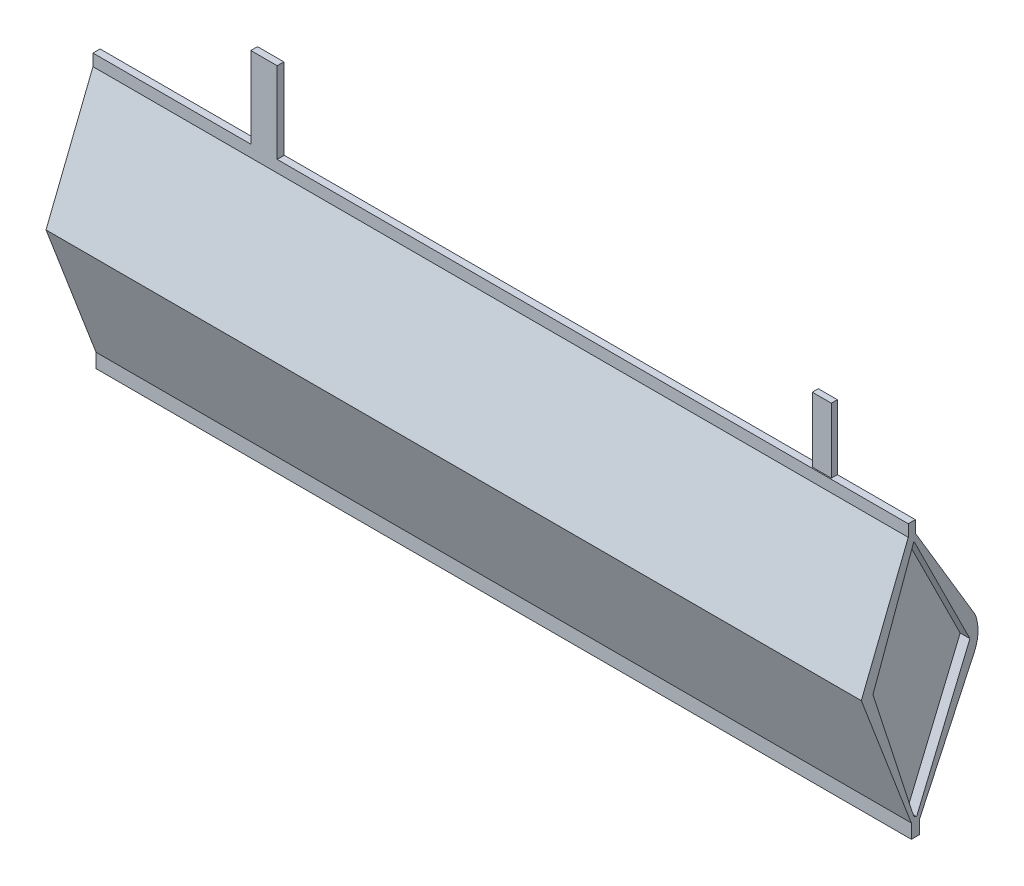
ISO-10303-21;
HEADER;
FILE_DESCRIPTION(('STEP AP214'),'2;1');
FILE_NAME('part.step','',(''),(''),'','','');
FILE_SCHEMA(('AUTOMOTIVE_DESIGN { 1 0 10303 214 1 1 1 1 }'));
ENDSEC;
DATA;
#1=APPLICATION_CONTEXT('core data for automotive mechanical design processes');
#2=APPLICATION_PROTOCOL_DEFINITION('international standard','automotive_design',2000,#1);
#3=PRODUCT_CONTEXT('',#1,'mechanical');
#4=PRODUCT('Part','Part','',(#3));
#5=PRODUCT_RELATED_PRODUCT_CATEGORY('part','',(#4));
#6=PRODUCT_DEFINITION_FORMATION('','',#4);
#7=PRODUCT_DEFINITION_CONTEXT('part definition',#1,'design');
#8=PRODUCT_DEFINITION('design','',#6,#7);
#9=PRODUCT_DEFINITION_SHAPE('','',#8);
#10=(LENGTH_UNIT() NAMED_UNIT(*) SI_UNIT(.MILLI.,.METRE.));
#11=(NAMED_UNIT(*) PLANE_ANGLE_UNIT() SI_UNIT($,.RADIAN.));
#12=(NAMED_UNIT(*) SI_UNIT($,.STERADIAN.) SOLID_ANGLE_UNIT());
#13=UNCERTAINTY_MEASURE_WITH_UNIT(LENGTH_MEASURE(1.E-05),#10,'distance_accuracy_value','');
#14=(GEOMETRIC_REPRESENTATION_CONTEXT(3) GLOBAL_UNCERTAINTY_ASSIGNED_CONTEXT((#13)) GLOBAL_UNIT_ASSIGNED_CONTEXT((#10,
#11,#12)) REPRESENTATION_CONTEXT('',''));
#15=CARTESIAN_POINT('',(0.,0.,0.));
#16=DIRECTION('',(0.,0.,1.));
#17=DIRECTION('',(1.,0.,0.));
#18=AXIS2_PLACEMENT_3D('',#15,#16,#17);
#19=CARTESIAN_POINT('',(-10.1405450074318,17.5056411192811,37.0439177567727));
#20=DIRECTION('',(0.,-1.,0.));
#21=DIRECTION('',(0.,0.,-1.));
#22=AXIS2_PLACEMENT_3D('',#19,#20,#21);
#23=PLANE('',#22);
#24=DIRECTION('',(0.,0.,-1.));
#25=VECTOR('',#24,1.);
#26=CARTESIAN_POINT('',(-62.8147187451587,17.5056411192811,28.9556068649932));
#27=LINE('',#26,#25);
#28=CARTESIAN_POINT('',(-62.8147187451587,17.5056411192811,29.7823314594479));
#29=VERTEX_POINT('',#28);
#30=CARTESIAN_POINT('',(-62.8147187451587,17.5056411192811,28.9556068649932));
#31=VERTEX_POINT('',#30);
#32=EDGE_CURVE('E261',#29,#31,#27,.T.);
#33=ORIENTED_EDGE('',*,*,#32,.F.);
#34=DIRECTION('',(1.,0.,0.));
#35=VECTOR('',#34,1.);
#36=CARTESIAN_POINT('',(-17.0060525794227,17.5056411192811,29.7823314594479));
#37=LINE('',#36,#35);
#38=CARTESIAN_POINT('',(14.9939474205773,17.5056411192811,29.7823314594479));
#39=VERTEX_POINT('',#38);
#40=EDGE_CURVE('E471',#29,#39,#37,.T.);
#41=ORIENTED_EDGE('',*,*,#40,.T.);
#42=DIRECTION('',(0.,0.,-1.));
#43=VECTOR('',#42,1.);
#44=CARTESIAN_POINT('',(14.9939474205773,17.5056411192811,37.0439177567727));
#45=LINE('',#44,#43);
#46=CARTESIAN_POINT('',(14.9939474205773,17.5056411192811,28.9060713444781));
#47=VERTEX_POINT('',#46);
#48=EDGE_CURVE('E475',#39,#47,#45,.T.);
#49=ORIENTED_EDGE('',*,*,#48,.T.);
#50=DIRECTION('',(1.,0.,0.));
#51=VECTOR('',#50,1.);
#52=CARTESIAN_POINT('',(-17.0060525794227,17.5056411192811,28.9060713444781));
#53=LINE('',#52,#51);
#54=CARTESIAN_POINT('',(5.37584407242301,17.5056411192811,28.9060713444781));
#55=VERTEX_POINT('',#54);
#56=EDGE_CURVE('E441',#55,#47,#53,.T.);
#57=ORIENTED_EDGE('',*,*,#56,.F.);
#58=DIRECTION('',(0.,0.,-1.));
#59=VECTOR('',#58,1.);
#60=CARTESIAN_POINT('',(5.37584407242301,17.5056411192811,29.6523771630587));
#61=LINE('',#60,#59);
#62=CARTESIAN_POINT('',(5.37584407242301,17.5056411192811,29.6523771630587));
#63=VERTEX_POINT('',#62);
#64=EDGE_CURVE('E360',#63,#55,#61,.T.);
#65=ORIENTED_EDGE('',*,*,#64,.F.);
#66=DIRECTION('',(1.,0.,0.));
#67=VECTOR('',#66,1.);
#68=CARTESIAN_POINT('',(5.37584407242301,17.5056411192811,29.6523771630587));
#69=LINE('',#68,#67);
#70=CARTESIAN_POINT('',(3.02748880821109,17.5056411192811,29.6523771630587));
#71=VERTEX_POINT('',#70);
#72=EDGE_CURVE('E369',#71,#63,#69,.T.);
#73=ORIENTED_EDGE('',*,*,#72,.F.);
#74=DIRECTION('',(0.,0.,1.));
#75=VECTOR('',#74,1.);
#76=CARTESIAN_POINT('',(3.02748880821109,17.5056411192811,29.6523771630587));
#77=LINE('',#76,#75);
#78=CARTESIAN_POINT('',(3.02748880821109,17.5056411192811,28.9060713444781));
#79=VERTEX_POINT('',#78);
#80=EDGE_CURVE('E355',#79,#71,#77,.T.);
#81=ORIENTED_EDGE('',*,*,#80,.F.);
#82=CARTESIAN_POINT('',(-85.5212621145849,17.5056411192811,28.9060713444781));
#83=VERTEX_POINT('',#82);
#84=EDGE_CURVE('E447',#83,#79,#53,.T.);
#85=ORIENTED_EDGE('',*,*,#84,.F.);
#86=DIRECTION('',(0.,0.,-1.));
#87=VECTOR('',#86,1.);
#88=CARTESIAN_POINT('',(-85.5212621145849,17.5056411192811,28.9060713444781));
#89=LINE('',#88,#87);
#90=CARTESIAN_POINT('',(-85.5212621145849,17.5056411192811,29.7823314594479));
#91=VERTEX_POINT('',#90);
#92=EDGE_CURVE('E303',#91,#83,#89,.T.);
#93=ORIENTED_EDGE('',*,*,#92,.F.);
#94=CARTESIAN_POINT('',(-66.0647373288725,17.5056411192811,29.7823314594479));
#95=VERTEX_POINT('',#94);
#96=EDGE_CURVE('E469',#91,#95,#37,.T.);
#97=ORIENTED_EDGE('',*,*,#96,.T.);
#98=DIRECTION('',(0.,0.,1.));
#99=VECTOR('',#98,1.);
#100=CARTESIAN_POINT('',(-66.0647373288725,17.5056411192811,28.9556068649932));
#101=LINE('',#100,#99);
#102=CARTESIAN_POINT('',(-66.0647373288725,17.5056411192811,28.9556068649932));
#103=VERTEX_POINT('',#102);
#104=EDGE_CURVE('E55',#103,#95,#101,.T.);
#105=ORIENTED_EDGE('',*,*,#104,.F.);
#106=DIRECTION('',(-1.,0.,0.));
#107=VECTOR('',#106,1.);
#108=CARTESIAN_POINT('',(-66.0647373288725,17.5056411192811,28.9556068649932));
#109=LINE('',#108,#107);
#110=EDGE_CURVE('E50',#31,#103,#109,.T.);
#111=ORIENTED_EDGE('',*,*,#110,.F.);
#112=EDGE_LOOP('',(#33,#41,#49,#57,#65,#73,#81,#85,#93,#97,#105,#111));
#113=FACE_BOUND('',#112,.T.);
#114=ADVANCED_FACE('F35',(#113),#23,.F.);
#115=CARTESIAN_POINT('',(14.9939474205773,17.5056411192811,37.0439177567727));
#116=DIRECTION('',(-1.,0.,0.));
#117=DIRECTION('',(0.,0.,1.));
#118=AXIS2_PLACEMENT_3D('',#115,#116,#117);
#119=PLANE('',#118);
#120=DIRECTION('',(0.,-0.939498101775437,0.34255410778496));
#121=VECTOR('',#120,1.);
#122=CARTESIAN_POINT('',(14.9939474205773,15.2881641035008,29.0885573251257));
#123=LINE('',#122,#121);
#124=CARTESIAN_POINT('',(14.9939474205773,15.2881641035008,29.0885573251257));
#125=VERTEX_POINT('',#124);
#126=CARTESIAN_POINT('',(14.9939474205773,1.43957116866306,34.1379474068146));
#127=VERTEX_POINT('',#126);
#128=EDGE_CURVE('E404',#125,#127,#123,.T.);
#129=ORIENTED_EDGE('',*,*,#128,.F.);
#130=DIRECTION('',(0.,0.894888871151744,0.446289041192766));
#131=VECTOR('',#130,1.);
#132=CARTESIAN_POINT('',(14.9939474205773,1.43957116866306,22.1821408280659));
#133=LINE('',#132,#131);
#134=CARTESIAN_POINT('',(14.9939474205773,1.43957116866306,22.1821408280659));
#135=VERTEX_POINT('',#134);
#136=EDGE_CURVE('E385',#135,#125,#133,.T.);
#137=ORIENTED_EDGE('',*,*,#136,.F.);
#138=DIRECTION('',(0.,0.922414525454659,-0.386201298845896));
#139=VECTOR('',#138,1.);
#140=CARTESIAN_POINT('',(14.9939474205773,-14.2700907355062,28.7595435731382));
#141=LINE('',#140,#139);
#142=CARTESIAN_POINT('',(14.9939474205773,-14.2700907355062,28.7595435731382));
#143=VERTEX_POINT('',#142);
#144=EDGE_CURVE('E390',#143,#135,#141,.T.);
#145=ORIENTED_EDGE('',*,*,#144,.F.);
#146=DIRECTION('',(0.,-0.423128591443833,-0.906069641419884));
#147=VECTOR('',#146,1.);
#148=CARTESIAN_POINT('',(14.9939474205773,-14.1164434670402,29.0885573251257));
#149=LINE('',#148,#147);
#150=CARTESIAN_POINT('',(14.9939474205773,-14.1164434670402,29.0885573251257));
#151=VERTEX_POINT('',#150);
#152=EDGE_CURVE('E410',#151,#143,#149,.T.);
#153=ORIENTED_EDGE('',*,*,#152,.F.);
#154=DIRECTION('',(0.,-0.951147499434773,-0.308736836673207));
#155=VECTOR('',#154,1.);
#156=CARTESIAN_POINT('',(14.9939474205773,1.43957116866306,34.1379474068146));
#157=LINE('',#156,#155);
#158=EDGE_CURVE('E407',#127,#151,#157,.T.);
#159=ORIENTED_EDGE('',*,*,#158,.F.);
#160=EDGE_LOOP('',(#129,#137,#145,#153,#159));
#161=FACE_BOUND('',#160,.T.);
#162=DIRECTION('',(0.,-0.906069641419884,0.423128591443834));
#163=VECTOR('',#162,1.);
#164=CARTESIAN_POINT('',(14.9939474205773,2.06125335554349,20.5544841655735));
#165=LINE('',#164,#163);
#166=CARTESIAN_POINT('',(14.9939474205773,-0.145561830209633,21.5850524115874));
#167=VERTEX_POINT('',#166);
#168=CARTESIAN_POINT('',(14.9939474205773,-14.6859081953666,28.3752989835319));
#169=VERTEX_POINT('',#168);
#170=EDGE_CURVE('E435',#167,#169,#165,.T.);
#171=ORIENTED_EDGE('',*,*,#170,.F.);
#172=CARTESIAN_POINT('',(14.9939474205773,1.83319011203405,26.222220961359));
#173=DIRECTION('',(-1.,0.,0.));
#174=DIRECTION('',(0.,0.,1.));
#175=AXIS2_PLACEMENT_3D('',#172,#173,#174);
#176=CIRCLE('',#175,5.04170520835203);
#177=CARTESIAN_POINT('',(14.9939474205773,3.73098867829227,21.5513375320887));
#178=VERTEX_POINT('',#177);
#179=EDGE_CURVE('E417',#167,#178,#176,.F.);
#180=ORIENTED_EDGE('',*,*,#179,.T.);
#181=DIRECTION('',(0.,-0.85862241369767,-0.512608574543957));
#182=VECTOR('',#181,1.);
#183=CARTESIAN_POINT('',(14.9939474205773,16.0502115935854,28.9060713444781));
#184=LINE('',#183,#182);
#185=CARTESIAN_POINT('',(14.9939474205773,16.0502115935854,28.9060713444781));
#186=VERTEX_POINT('',#185);
#187=EDGE_CURVE('E433',#186,#178,#184,.T.);
#188=ORIENTED_EDGE('',*,*,#187,.F.);
#189=DIRECTION('',(0.,-1.,0.));
#190=VECTOR('',#189,1.);
#191=CARTESIAN_POINT('',(14.9939474205773,17.5056411192811,28.9060713444781));
#192=LINE('',#191,#190);
#193=EDGE_CURVE('E430',#47,#186,#192,.T.);
#194=ORIENTED_EDGE('',*,*,#193,.F.);
#195=ORIENTED_EDGE('',*,*,#48,.F.);
#196=DIRECTION('',(0.,-1.,0.));
#197=VECTOR('',#196,1.);
#198=CARTESIAN_POINT('',(14.9939474205773,0.561189804540041,29.7823314594479));
#199=LINE('',#198,#197);
#200=CARTESIAN_POINT('',(14.9939474205773,16.0524594077059,29.7823314594479));
#201=VERTEX_POINT('',#200);
#202=EDGE_CURVE('E452',#39,#201,#199,.T.);
#203=ORIENTED_EDGE('',*,*,#202,.T.);
#204=DIRECTION('',(0.,-0.928999989043887,0.370079748644069));
#205=VECTOR('',#204,1.);
#206=CARTESIAN_POINT('',(14.9939474205773,7.06237754820205,33.3636525295148));
#207=LINE('',#206,#205);
#208=CARTESIAN_POINT('',(14.9939474205773,1.51675664046694,35.5728258511659));
#209=VERTEX_POINT('',#208);
#210=EDGE_CURVE('E444',#201,#209,#207,.T.);
#211=ORIENTED_EDGE('',*,*,#210,.T.);
#212=DIRECTION('',(0.,-0.934146484006521,-0.356889823920849));
#213=VECTOR('',#212,1.);
#214=CARTESIAN_POINT('',(14.9939474205773,-5.49440333280212,32.8942184901351));
#215=LINE('',#214,#213);
#216=CARTESIAN_POINT('',(14.9939474205773,-14.6317808860375,29.4032916152771));
#217=VERTEX_POINT('',#216);
#218=EDGE_CURVE('E458',#209,#217,#215,.T.);
#219=ORIENTED_EDGE('',*,*,#218,.T.);
#220=DIRECTION('',(0.,-1.,0.));
#221=VECTOR('',#220,1.);
#222=CARTESIAN_POINT('',(14.9939474205773,0.561189804540041,29.4032916152771));
#223=LINE('',#222,#221);
#224=CARTESIAN_POINT('',(14.9939474205773,-16.383261510201,29.4032916152771));
#225=VERTEX_POINT('',#224);
#226=EDGE_CURVE('E455',#217,#225,#223,.T.);
#227=ORIENTED_EDGE('',*,*,#226,.T.);
#228=DIRECTION('',(0.,0.,-1.));
#229=VECTOR('',#228,1.);
#230=CARTESIAN_POINT('',(14.9939474205773,-16.383261510201,37.0439177567727));
#231=LINE('',#230,#229);
#232=CARTESIAN_POINT('',(14.9939474205773,-16.383261510201,28.3752989835319));
#233=VERTEX_POINT('',#232);
#234=EDGE_CURVE('E464',#225,#233,#231,.T.);
#235=ORIENTED_EDGE('',*,*,#234,.T.);
#236=DIRECTION('',(0.,-1.,0.));
#237=VECTOR('',#236,1.);
#238=CARTESIAN_POINT('',(14.9939474205773,-14.6859081953666,28.3752989835319));
#239=LINE('',#238,#237);
#240=EDGE_CURVE('E438',#169,#233,#239,.T.);
#241=ORIENTED_EDGE('',*,*,#240,.F.);
#242=EDGE_LOOP('',(#171,#180,#188,#194,#195,#203,#211,#219,#227,#235,#241));
#243=FACE_BOUND('',#242,.T.);
#244=ADVANCED_FACE('F37',(#161,#243),#119,.F.);
#245=CARTESIAN_POINT('',(-10.1405450074318,-16.383261510201,37.0439177567727));
#246=DIRECTION('',(0.,1.,0.));
#247=DIRECTION('',(0.,0.,1.));
#248=AXIS2_PLACEMENT_3D('',#245,#246,#247);
#249=PLANE('',#248);
#250=DIRECTION('',(0.,0.,1.));
#251=VECTOR('',#250,1.);
#252=CARTESIAN_POINT('',(-5.52126211458491,-16.383261510201,29.4032916152771));
#253=LINE('',#252,#251);
#254=CARTESIAN_POINT('',(-5.52126211458491,-16.383261510201,28.0872107985033));
#255=VERTEX_POINT('',#254);
#256=CARTESIAN_POINT('',(-5.52126211458491,-16.383261510201,28.3752989835319));
#257=VERTEX_POINT('',#256);
#258=EDGE_CURVE('E274',#255,#257,#253,.T.);
#259=ORIENTED_EDGE('',*,*,#258,.T.);
#260=DIRECTION('',(1.,0.,0.));
#261=VECTOR('',#260,1.);
#262=CARTESIAN_POINT('',(-10.1405450074318,-16.383261510201,28.3752989835319));
#263=LINE('',#262,#261);
#264=EDGE_CURVE('E43',#257,#233,#263,.T.);
#265=ORIENTED_EDGE('',*,*,#264,.T.);
#266=ORIENTED_EDGE('',*,*,#234,.F.);
#267=DIRECTION('',(1.,0.,0.));
#268=VECTOR('',#267,1.);
#269=CARTESIAN_POINT('',(-17.0060525794227,-16.383261510201,29.4032916152771));
#270=LINE('',#269,#268);
#271=CARTESIAN_POINT('',(-85.5212621145849,-16.383261510201,29.4032916152771));
#272=VERTEX_POINT('',#271);
#273=EDGE_CURVE('E467',#272,#225,#270,.T.);
#274=ORIENTED_EDGE('',*,*,#273,.F.);
#275=DIRECTION('',(0.,0.,1.));
#276=VECTOR('',#275,1.);
#277=CARTESIAN_POINT('',(-85.5212621145849,-16.383261510201,29.4032916152771));
#278=LINE('',#277,#276);
#279=CARTESIAN_POINT('',(-85.5212621145849,-16.383261510201,28.0872107985033));
#280=VERTEX_POINT('',#279);
#281=EDGE_CURVE('E288',#280,#272,#278,.T.);
#282=ORIENTED_EDGE('',*,*,#281,.F.);
#283=DIRECTION('',(1.,0.,0.));
#284=VECTOR('',#283,1.);
#285=CARTESIAN_POINT('',(-85.5212621145849,-16.383261510201,28.0872107985033));
#286=LINE('',#285,#284);
#287=EDGE_CURVE('E305',#280,#255,#286,.T.);
#288=ORIENTED_EDGE('',*,*,#287,.T.);
#289=EDGE_LOOP('',(#259,#265,#266,#274,#282,#288));
#290=FACE_BOUND('',#289,.T.);
#291=ADVANCED_FACE('F480',(#290),#249,.F.);
#292=CARTESIAN_POINT('',(-17.0060525794227,7.06237754820205,33.3636525295148));
#293=DIRECTION('',(0.,0.370079748644069,0.928999989043887));
#294=DIRECTION('',(0.,-0.928999989043887,0.370079748644069));
#295=AXIS2_PLACEMENT_3D('',#292,#293,#294);
#296=PLANE('',#295);
#297=DIRECTION('',(1.,0.,0.));
#298=VECTOR('',#297,1.);
#299=CARTESIAN_POINT('',(-17.0060525794227,16.0524594077059,29.7823314594479));
#300=LINE('',#299,#298);
#301=CARTESIAN_POINT('',(-85.5212621145849,16.0524594077059,29.7823314594479));
#302=VERTEX_POINT('',#301);
#303=EDGE_CURVE('E461',#302,#201,#300,.T.);
#304=ORIENTED_EDGE('',*,*,#303,.F.);
#305=DIRECTION('',(0.,0.928999989043887,-0.370079748644069));
#306=VECTOR('',#305,1.);
#307=CARTESIAN_POINT('',(-85.5212621145849,16.0524594077059,29.7823314594479));
#308=LINE('',#307,#306);
#309=CARTESIAN_POINT('',(-85.5212621145849,1.51675664046694,35.5728258511659));
#310=VERTEX_POINT('',#309);
#311=EDGE_CURVE('E297',#310,#302,#308,.T.);
#312=ORIENTED_EDGE('',*,*,#311,.F.);
#313=DIRECTION('',(1.,0.,0.));
#314=VECTOR('',#313,1.);
#315=CARTESIAN_POINT('',(-17.0060525794227,1.51675664046694,35.5728258511659));
#316=LINE('',#315,#314);
#317=EDGE_CURVE('E462',#310,#209,#316,.T.);
#318=ORIENTED_EDGE('',*,*,#317,.T.);
#319=ORIENTED_EDGE('',*,*,#210,.F.);
#320=EDGE_LOOP('',(#304,#312,#318,#319));
#321=FACE_BOUND('',#320,.T.);
#322=ADVANCED_FACE('F529',(#321),#296,.T.);
#323=CARTESIAN_POINT('',(-17.0060525794227,-5.49440333280212,32.8942184901351));
#324=DIRECTION('',(0.,-0.356889823920849,0.934146484006521));
#325=DIRECTION('',(0.,-0.934146484006521,-0.356889823920849));
#326=AXIS2_PLACEMENT_3D('',#323,#324,#325);
#327=PLANE('',#326);
#328=ORIENTED_EDGE('',*,*,#317,.F.);
#329=DIRECTION('',(0.,0.934146484006521,0.356889823920849));
#330=VECTOR('',#329,1.);
#331=CARTESIAN_POINT('',(-85.5212621145849,1.51675664046694,35.5728258511659));
#332=LINE('',#331,#330);
#333=CARTESIAN_POINT('',(-85.5212621145849,-14.6317808860375,29.4032916152771));
#334=VERTEX_POINT('',#333);
#335=EDGE_CURVE('E294',#334,#310,#332,.T.);
#336=ORIENTED_EDGE('',*,*,#335,.F.);
#337=DIRECTION('',(1.,0.,0.));
#338=VECTOR('',#337,1.);
#339=CARTESIAN_POINT('',(-17.0060525794227,-14.6317808860375,29.4032916152771));
#340=LINE('',#339,#338);
#341=EDGE_CURVE('E465',#334,#217,#340,.T.);
#342=ORIENTED_EDGE('',*,*,#341,.T.);
#343=ORIENTED_EDGE('',*,*,#218,.F.);
#344=EDGE_LOOP('',(#328,#336,#342,#343));
#345=FACE_BOUND('',#344,.T.);
#346=ADVANCED_FACE('F532',(#345),#327,.T.);
#347=CARTESIAN_POINT('',(-17.0060525794227,0.561189804540041,29.7823314594479));
#348=DIRECTION('',(0.,0.,1.));
#349=DIRECTION('',(1.,0.,0.));
#350=AXIS2_PLACEMENT_3D('',#347,#348,#349);
#351=PLANE('',#350);
#352=ORIENTED_EDGE('',*,*,#96,.F.);
#353=DIRECTION('',(0.,1.,0.));
#354=VECTOR('',#353,1.);
#355=CARTESIAN_POINT('',(-85.5212621145849,17.5056411192811,29.7823314594479));
#356=LINE('',#355,#354);
#357=EDGE_CURVE('E300',#302,#91,#356,.T.);
#358=ORIENTED_EDGE('',*,*,#357,.F.);
#359=ORIENTED_EDGE('',*,*,#303,.T.);
#360=ORIENTED_EDGE('',*,*,#202,.F.);
#361=ORIENTED_EDGE('',*,*,#40,.F.);
#362=DIRECTION('',(0.,-1.,0.));
#363=VECTOR('',#362,1.);
#364=CARTESIAN_POINT('',(-62.8147187451587,27.5056411192811,29.7823314594479));
#365=LINE('',#364,#363);
#366=CARTESIAN_POINT('',(-62.8147187451587,27.5056411192811,29.7823314594479));
#367=VERTEX_POINT('',#366);
#368=EDGE_CURVE('E542',#367,#29,#365,.T.);
#369=ORIENTED_EDGE('',*,*,#368,.F.);
#370=DIRECTION('',(1.,0.,0.));
#371=VECTOR('',#370,1.);
#372=CARTESIAN_POINT('',(-66.0647373288725,27.5056411192811,29.7823314594479));
#373=LINE('',#372,#371);
#374=CARTESIAN_POINT('',(-66.0647373288725,27.5056411192811,29.7823314594479));
#375=VERTEX_POINT('',#374);
#376=EDGE_CURVE('E255',#375,#367,#373,.T.);
#377=ORIENTED_EDGE('',*,*,#376,.F.);
#378=DIRECTION('',(0.,-1.,0.));
#379=VECTOR('',#378,1.);
#380=CARTESIAN_POINT('',(-66.0647373288725,27.5056411192811,29.7823314594479));
#381=LINE('',#380,#379);
#382=EDGE_CURVE('E266',#375,#95,#381,.T.);
#383=ORIENTED_EDGE('',*,*,#382,.T.);
#384=EDGE_LOOP('',(#352,#358,#359,#360,#361,#369,#377,#383));
#385=FACE_BOUND('',#384,.T.);
#386=ADVANCED_FACE('F525',(#385),#351,.T.);
#387=CARTESIAN_POINT('',(-17.0060525794227,0.561189804540041,29.4032916152771));
#388=DIRECTION('',(0.,0.,1.));
#389=DIRECTION('',(1.,0.,0.));
#390=AXIS2_PLACEMENT_3D('',#387,#388,#389);
#391=PLANE('',#390);
#392=ORIENTED_EDGE('',*,*,#341,.F.);
#393=DIRECTION('',(0.,1.,0.));
#394=VECTOR('',#393,1.);
#395=CARTESIAN_POINT('',(-85.5212621145849,-14.6317808860375,29.4032916152771));
#396=LINE('',#395,#394);
#397=EDGE_CURVE('E291',#272,#334,#396,.T.);
#398=ORIENTED_EDGE('',*,*,#397,.F.);
#399=ORIENTED_EDGE('',*,*,#273,.T.);
#400=ORIENTED_EDGE('',*,*,#226,.F.);
#401=EDGE_LOOP('',(#392,#398,#399,#400));
#402=FACE_BOUND('',#401,.T.);
#403=ADVANCED_FACE('F491',(#402),#391,.T.);
#404=CARTESIAN_POINT('',(-17.0060525794227,2.06125335554349,20.5544841655735));
#405=DIRECTION('',(0.,0.423128591443834,0.906069641419884));
#406=DIRECTION('',(0.,-0.906069641419884,0.423128591443834));
#407=AXIS2_PLACEMENT_3D('',#404,#405,#406);
#408=PLANE('',#407);
#409=DIRECTION('',(1.,0.,0.));
#410=VECTOR('',#409,1.);
#411=CARTESIAN_POINT('',(-17.0060525794227,-14.6859081953666,28.3752989835319));
#412=LINE('',#411,#410);
#413=CARTESIAN_POINT('',(-5.52126211458491,-14.6859081953666,28.3752989835319));
#414=VERTEX_POINT('',#413);
#415=EDGE_CURVE('E442',#414,#169,#412,.T.);
#416=ORIENTED_EDGE('',*,*,#415,.F.);
#417=DIRECTION('',(0.,0.906069641419884,-0.423128591443834));
#418=VECTOR('',#417,1.);
#419=CARTESIAN_POINT('',(-5.52126211458491,2.06125335554349,20.5544841655735));
#420=LINE('',#419,#418);
#421=CARTESIAN_POINT('',(-5.5212621145849,-0.145561830209644,21.5850524115874));
#422=VERTEX_POINT('',#421);
#423=EDGE_CURVE('E349',#414,#422,#420,.T.);
#424=ORIENTED_EDGE('',*,*,#423,.T.);
#425=DIRECTION('',(-1.,0.,0.));
#426=VECTOR('',#425,1.);
#427=CARTESIAN_POINT('',(21.8594549925682,-0.145561830209657,21.5850524115874));
#428=LINE('',#427,#426);
#429=EDGE_CURVE('E428',#422,#167,#428,.F.);
#430=ORIENTED_EDGE('',*,*,#429,.T.);
#431=ORIENTED_EDGE('',*,*,#170,.T.);
#432=EDGE_LOOP('',(#416,#424,#430,#431));
#433=FACE_BOUND('',#432,.T.);
#434=ADVANCED_FACE('F508',(#433),#408,.F.);
#435=CARTESIAN_POINT('',(-17.0060525794227,16.0502115935854,28.9060713444781));
#436=DIRECTION('',(0.,-0.512608574543957,0.85862241369767));
#437=DIRECTION('',(0.,-0.85862241369767,-0.512608574543957));
#438=AXIS2_PLACEMENT_3D('',#435,#436,#437);
#439=PLANE('',#438);
#440=DIRECTION('',(-1.,0.,0.));
#441=VECTOR('',#440,1.);
#442=CARTESIAN_POINT('',(21.8594549925682,3.73098867829227,21.5513375320887));
#443=LINE('',#442,#441);
#444=CARTESIAN_POINT('',(-5.52126211458491,3.73098867829227,21.5513375320887));
#445=VERTEX_POINT('',#444);
#446=EDGE_CURVE('E11',#178,#445,#443,.T.);
#447=ORIENTED_EDGE('',*,*,#446,.T.);
#448=DIRECTION('',(0.,0.85862241369767,0.512608574543957));
#449=VECTOR('',#448,1.);
#450=CARTESIAN_POINT('',(-5.52126211458491,16.0502115935854,28.9060713444781));
#451=LINE('',#450,#449);
#452=CARTESIAN_POINT('',(-5.52126211458491,16.0502115935854,28.9060713444781));
#453=VERTEX_POINT('',#452);
#454=EDGE_CURVE('E343',#445,#453,#451,.T.);
#455=ORIENTED_EDGE('',*,*,#454,.T.);
#456=DIRECTION('',(1.,0.,0.));
#457=VECTOR('',#456,1.);
#458=CARTESIAN_POINT('',(-17.0060525794227,16.0502115935854,28.9060713444781));
#459=LINE('',#458,#457);
#460=EDGE_CURVE('E445',#453,#186,#459,.T.);
#461=ORIENTED_EDGE('',*,*,#460,.T.);
#462=ORIENTED_EDGE('',*,*,#187,.T.);
#463=EDGE_LOOP('',(#447,#455,#461,#462));
#464=FACE_BOUND('',#463,.T.);
#465=ADVANCED_FACE('F517',(#464),#439,.F.);
#466=CARTESIAN_POINT('',(-17.0060525794227,17.5056411192811,28.9060713444781));
#467=DIRECTION('',(0.,0.,1.));
#468=DIRECTION('',(1.,0.,0.));
#469=AXIS2_PLACEMENT_3D('',#466,#467,#468);
#470=PLANE('',#469);
#471=ORIENTED_EDGE('',*,*,#460,.F.);
#472=DIRECTION('',(1.,0.,0.));
#473=VECTOR('',#472,1.);
#474=CARTESIAN_POINT('',(-85.5212621145849,16.0502115935854,28.9060713444781));
#475=LINE('',#474,#473);
#476=CARTESIAN_POINT('',(-85.5212621145849,16.0502115935854,28.9060713444781));
#477=VERTEX_POINT('',#476);
#478=EDGE_CURVE('E340',#477,#453,#475,.T.);
#479=ORIENTED_EDGE('',*,*,#478,.F.);
#480=DIRECTION('',(0.,-1.,0.));
#481=VECTOR('',#480,1.);
#482=CARTESIAN_POINT('',(-85.5212621145849,16.0502115935854,28.9060713444781));
#483=LINE('',#482,#481);
#484=EDGE_CURVE('E270',#83,#477,#483,.T.);
#485=ORIENTED_EDGE('',*,*,#484,.F.);
#486=ORIENTED_EDGE('',*,*,#84,.T.);
#487=DIRECTION('',(0.,-1.,0.));
#488=VECTOR('',#487,1.);
#489=CARTESIAN_POINT('',(3.02748880821109,25.5056411192811,28.9060713444781));
#490=LINE('',#489,#488);
#491=CARTESIAN_POINT('',(3.02748880821109,25.5056411192811,28.9060713444781));
#492=VERTEX_POINT('',#491);
#493=EDGE_CURVE('E366',#492,#79,#490,.T.);
#494=ORIENTED_EDGE('',*,*,#493,.F.);
#495=DIRECTION('',(-1.,0.,0.));
#496=VECTOR('',#495,1.);
#497=CARTESIAN_POINT('',(5.37584407242301,25.5056411192811,28.9060713444781));
#498=LINE('',#497,#496);
#499=CARTESIAN_POINT('',(5.37584407242301,25.5056411192811,28.9060713444781));
#500=VERTEX_POINT('',#499);
#501=EDGE_CURVE('E364',#500,#492,#498,.T.);
#502=ORIENTED_EDGE('',*,*,#501,.F.);
#503=DIRECTION('',(0.,-1.,0.));
#504=VECTOR('',#503,1.);
#505=CARTESIAN_POINT('',(5.37584407242301,25.5056411192811,28.9060713444781));
#506=LINE('',#505,#504);
#507=EDGE_CURVE('E376',#500,#55,#506,.T.);
#508=ORIENTED_EDGE('',*,*,#507,.T.);
#509=ORIENTED_EDGE('',*,*,#56,.T.);
#510=ORIENTED_EDGE('',*,*,#193,.T.);
#511=EDGE_LOOP('',(#471,#479,#485,#486,#494,#502,#508,#509,#510));
#512=FACE_BOUND('',#511,.T.);
#513=ADVANCED_FACE('F521',(#512),#470,.F.);
#514=CARTESIAN_POINT('',(-17.0060525794227,-14.6859081953666,28.3752989835319));
#515=DIRECTION('',(0.,0.,1.));
#516=DIRECTION('',(1.,0.,0.));
#517=AXIS2_PLACEMENT_3D('',#514,#515,#516);
#518=PLANE('',#517);
#519=ORIENTED_EDGE('',*,*,#264,.F.);
#520=DIRECTION('',(0.,1.,0.));
#521=VECTOR('',#520,1.);
#522=CARTESIAN_POINT('',(-5.52126211458491,-14.6859081953666,28.3752989835319));
#523=LINE('',#522,#521);
#524=EDGE_CURVE('E352',#257,#414,#523,.T.);
#525=ORIENTED_EDGE('',*,*,#524,.T.);
#526=ORIENTED_EDGE('',*,*,#415,.T.);
#527=ORIENTED_EDGE('',*,*,#240,.T.);
#528=EDGE_LOOP('',(#519,#525,#526,#527));
#529=FACE_BOUND('',#528,.T.);
#530=ADVANCED_FACE('F484',(#529),#518,.F.);
#531=CARTESIAN_POINT('',(21.8594549925682,1.83319011203405,26.222220961359));
#532=DIRECTION('',(-1.,0.,0.));
#533=DIRECTION('',(0.,0.,1.));
#534=AXIS2_PLACEMENT_3D('',#531,#532,#533);
#535=CYLINDRICAL_SURFACE('',#534,5.04170520835203);
#536=ORIENTED_EDGE('',*,*,#429,.F.);
#537=CARTESIAN_POINT('',(-5.5212621145849,1.83319011203405,26.222220961359));
#538=DIRECTION('',(1.,0.,0.));
#539=DIRECTION('',(0.,0.,-1.));
#540=AXIS2_PLACEMENT_3D('',#537,#538,#539);
#541=CIRCLE('',#540,5.04170520835203);
#542=EDGE_CURVE('E346',#422,#445,#541,.T.);
#543=ORIENTED_EDGE('',*,*,#542,.T.);
#544=ORIENTED_EDGE('',*,*,#446,.F.);
#545=ORIENTED_EDGE('',*,*,#179,.F.);
#546=EDGE_LOOP('',(#536,#543,#544,#545));
#547=FACE_BOUND('',#546,.T.);
#548=ADVANCED_FACE('F515',(#547),#535,.T.);
#549=CARTESIAN_POINT('',(13.7939474205773,1.43957116866306,22.1821408280659));
#550=DIRECTION('',(0.,0.446289041192766,-0.894888871151744));
#551=DIRECTION('',(0.,0.894888871151744,0.446289041192766));
#552=AXIS2_PLACEMENT_3D('',#549,#550,#551);
#553=PLANE('',#552);
#554=ORIENTED_EDGE('',*,*,#136,.T.);
#555=DIRECTION('',(1.,0.,0.));
#556=VECTOR('',#555,1.);
#557=CARTESIAN_POINT('',(13.7939474205773,15.2881641035008,29.0885573251257));
#558=LINE('',#557,#556);
#559=CARTESIAN_POINT('',(13.7939474205773,15.2881641035008,29.0885573251257));
#560=VERTEX_POINT('',#559);
#561=EDGE_CURVE('E402',#560,#125,#558,.T.);
#562=ORIENTED_EDGE('',*,*,#561,.F.);
#563=DIRECTION('',(0.,0.894888871151744,0.446289041192766));
#564=VECTOR('',#563,1.);
#565=CARTESIAN_POINT('',(13.7939474205773,1.43957116866306,22.1821408280659));
#566=LINE('',#565,#564);
#567=CARTESIAN_POINT('',(13.7939474205773,1.43957116866306,22.1821408280659));
#568=VERTEX_POINT('',#567);
#569=EDGE_CURVE('E386',#568,#560,#566,.T.);
#570=ORIENTED_EDGE('',*,*,#569,.F.);
#571=DIRECTION('',(1.,0.,0.));
#572=VECTOR('',#571,1.);
#573=CARTESIAN_POINT('',(13.7939474205773,1.43957116866306,22.1821408280659));
#574=LINE('',#573,#572);
#575=EDGE_CURVE('E415',#568,#135,#574,.T.);
#576=ORIENTED_EDGE('',*,*,#575,.T.);
#577=EDGE_LOOP('',(#554,#562,#570,#576));
#578=FACE_BOUND('',#577,.T.);
#579=ADVANCED_FACE('F579',(#578),#553,.F.);
#580=CARTESIAN_POINT('',(13.7939474205773,-14.2700907355062,28.7595435731382));
#581=DIRECTION('',(0.,-0.386201298845896,-0.922414525454659));
#582=DIRECTION('',(0.,0.922414525454659,-0.386201298845896));
#583=AXIS2_PLACEMENT_3D('',#580,#581,#582);
#584=PLANE('',#583);
#585=ORIENTED_EDGE('',*,*,#144,.T.);
#586=ORIENTED_EDGE('',*,*,#575,.F.);
#587=DIRECTION('',(0.,0.922414525454659,-0.386201298845896));
#588=VECTOR('',#587,1.);
#589=CARTESIAN_POINT('',(13.7939474205773,-14.2700907355062,28.7595435731382));
#590=LINE('',#589,#588);
#591=CARTESIAN_POINT('',(13.7939474205773,-14.2700907355062,28.7595435731382));
#592=VERTEX_POINT('',#591);
#593=EDGE_CURVE('E399',#592,#568,#590,.T.);
#594=ORIENTED_EDGE('',*,*,#593,.F.);
#595=DIRECTION('',(1.,0.,0.));
#596=VECTOR('',#595,1.);
#597=CARTESIAN_POINT('',(13.7939474205773,-14.2700907355062,28.7595435731382));
#598=LINE('',#597,#596);
#599=EDGE_CURVE('E418',#592,#143,#598,.T.);
#600=ORIENTED_EDGE('',*,*,#599,.T.);
#601=EDGE_LOOP('',(#585,#586,#594,#600));
#602=FACE_BOUND('',#601,.T.);
#603=ADVANCED_FACE('F582',(#602),#584,.F.);
#604=CARTESIAN_POINT('',(13.7939474205773,-14.1164434670402,29.0885573251257));
#605=DIRECTION('',(0.,-0.906069641419884,0.423128591443833));
#606=DIRECTION('',(0.,-0.423128591443833,-0.906069641419884));
#607=AXIS2_PLACEMENT_3D('',#604,#605,#606);
#608=PLANE('',#607);
#609=ORIENTED_EDGE('',*,*,#152,.T.);
#610=ORIENTED_EDGE('',*,*,#599,.F.);
#611=DIRECTION('',(0.,-0.423128591443833,-0.906069641419884));
#612=VECTOR('',#611,1.);
#613=CARTESIAN_POINT('',(13.7939474205773,-14.1164434670402,29.0885573251257));
#614=LINE('',#613,#612);
#615=CARTESIAN_POINT('',(13.7939474205773,-14.1164434670402,29.0885573251257));
#616=VERTEX_POINT('',#615);
#617=EDGE_CURVE('E396',#616,#592,#614,.T.);
#618=ORIENTED_EDGE('',*,*,#617,.F.);
#619=DIRECTION('',(1.,0.,0.));
#620=VECTOR('',#619,1.);
#621=CARTESIAN_POINT('',(13.7939474205773,-14.1164434670402,29.0885573251257));
#622=LINE('',#621,#620);
#623=EDGE_CURVE('E420',#616,#151,#622,.T.);
#624=ORIENTED_EDGE('',*,*,#623,.T.);
#625=EDGE_LOOP('',(#609,#610,#618,#624));
#626=FACE_BOUND('',#625,.T.);
#627=ADVANCED_FACE('F592',(#626),#608,.F.);
#628=CARTESIAN_POINT('',(13.7939474205773,1.43957116866306,34.1379474068146));
#629=DIRECTION('',(0.,-0.308736836673207,0.951147499434773));
#630=DIRECTION('',(0.,-0.951147499434773,-0.308736836673207));
#631=AXIS2_PLACEMENT_3D('',#628,#629,#630);
#632=PLANE('',#631);
#633=ORIENTED_EDGE('',*,*,#158,.T.);
#634=ORIENTED_EDGE('',*,*,#623,.F.);
#635=DIRECTION('',(0.,-0.951147499434773,-0.308736836673207));
#636=VECTOR('',#635,1.);
#637=CARTESIAN_POINT('',(13.7939474205773,1.43957116866306,34.1379474068146));
#638=LINE('',#637,#636);
#639=CARTESIAN_POINT('',(13.7939474205773,1.43957116866306,34.1379474068146));
#640=VERTEX_POINT('',#639);
#641=EDGE_CURVE('E393',#640,#616,#638,.T.);
#642=ORIENTED_EDGE('',*,*,#641,.F.);
#643=DIRECTION('',(1.,0.,0.));
#644=VECTOR('',#643,1.);
#645=CARTESIAN_POINT('',(13.7939474205773,1.43957116866306,34.1379474068146));
#646=LINE('',#645,#644);
#647=EDGE_CURVE('E422',#640,#127,#646,.T.);
#648=ORIENTED_EDGE('',*,*,#647,.T.);
#649=EDGE_LOOP('',(#633,#634,#642,#648));
#650=FACE_BOUND('',#649,.T.);
#651=ADVANCED_FACE('F588',(#650),#632,.F.);
#652=CARTESIAN_POINT('',(13.7939474205773,15.2881641035008,29.0885573251257));
#653=DIRECTION('',(0.,0.34255410778496,0.939498101775437));
#654=DIRECTION('',(0.,-0.939498101775437,0.34255410778496));
#655=AXIS2_PLACEMENT_3D('',#652,#653,#654);
#656=PLANE('',#655);
#657=ORIENTED_EDGE('',*,*,#128,.T.);
#658=ORIENTED_EDGE('',*,*,#647,.F.);
#659=DIRECTION('',(0.,-0.939498101775437,0.34255410778496));
#660=VECTOR('',#659,1.);
#661=CARTESIAN_POINT('',(13.7939474205773,15.2881641035008,29.0885573251257));
#662=LINE('',#661,#660);
#663=EDGE_CURVE('E389',#560,#640,#662,.T.);
#664=ORIENTED_EDGE('',*,*,#663,.F.);
#665=ORIENTED_EDGE('',*,*,#561,.T.);
#666=EDGE_LOOP('',(#657,#658,#664,#665));
#667=FACE_BOUND('',#666,.T.);
#668=ADVANCED_FACE('F584',(#667),#656,.F.);
#669=CARTESIAN_POINT('',(13.7939474205773,0.561189804540041,17.0439177567727));
#670=DIRECTION('',(-1.,0.,0.));
#671=DIRECTION('',(0.,0.,1.));
#672=AXIS2_PLACEMENT_3D('',#669,#670,#671);
#673=PLANE('',#672);
#674=ORIENTED_EDGE('',*,*,#569,.T.);
#675=ORIENTED_EDGE('',*,*,#663,.T.);
#676=ORIENTED_EDGE('',*,*,#641,.T.);
#677=ORIENTED_EDGE('',*,*,#617,.T.);
#678=ORIENTED_EDGE('',*,*,#593,.T.);
#679=EDGE_LOOP('',(#674,#675,#676,#677,#678));
#680=FACE_BOUND('',#679,.T.);
#681=ADVANCED_FACE('F587',(#680),#673,.F.);
#682=CARTESIAN_POINT('',(3.02748880821109,25.5056411192811,29.6523771630587));
#683=DIRECTION('',(1.,0.,0.));
#684=DIRECTION('',(0.,0.,-1.));
#685=AXIS2_PLACEMENT_3D('',#682,#683,#684);
#686=PLANE('',#685);
#687=ORIENTED_EDGE('',*,*,#80,.T.);
#688=DIRECTION('',(0.,-1.,0.));
#689=VECTOR('',#688,1.);
#690=CARTESIAN_POINT('',(3.02748880821109,25.5056411192811,29.6523771630587));
#691=LINE('',#690,#689);
#692=CARTESIAN_POINT('',(3.02748880821109,25.5056411192811,29.6523771630587));
#693=VERTEX_POINT('',#692);
#694=EDGE_CURVE('E382',#693,#71,#691,.T.);
#695=ORIENTED_EDGE('',*,*,#694,.F.);
#696=DIRECTION('',(0.,0.,1.));
#697=VECTOR('',#696,1.);
#698=CARTESIAN_POINT('',(3.02748880821109,25.5056411192811,29.6523771630587));
#699=LINE('',#698,#697);
#700=EDGE_CURVE('E356',#492,#693,#699,.T.);
#701=ORIENTED_EDGE('',*,*,#700,.F.);
#702=ORIENTED_EDGE('',*,*,#493,.T.);
#703=EDGE_LOOP('',(#687,#695,#701,#702));
#704=FACE_BOUND('',#703,.T.);
#705=ADVANCED_FACE('F602',(#704),#686,.F.);
#706=CARTESIAN_POINT('',(5.37584407242301,25.5056411192811,29.6523771630587));
#707=DIRECTION('',(0.,0.,-1.));
#708=DIRECTION('',(-1.,0.,0.));
#709=AXIS2_PLACEMENT_3D('',#706,#707,#708);
#710=PLANE('',#709);
#711=ORIENTED_EDGE('',*,*,#72,.T.);
#712=DIRECTION('',(0.,-1.,0.));
#713=VECTOR('',#712,1.);
#714=CARTESIAN_POINT('',(5.37584407242301,25.5056411192811,29.6523771630587));
#715=LINE('',#714,#713);
#716=CARTESIAN_POINT('',(5.37584407242301,25.5056411192811,29.6523771630587));
#717=VERTEX_POINT('',#716);
#718=EDGE_CURVE('E379',#717,#63,#715,.T.);
#719=ORIENTED_EDGE('',*,*,#718,.F.);
#720=DIRECTION('',(1.,0.,0.));
#721=VECTOR('',#720,1.);
#722=CARTESIAN_POINT('',(5.37584407242301,25.5056411192811,29.6523771630587));
#723=LINE('',#722,#721);
#724=EDGE_CURVE('E359',#693,#717,#723,.T.);
#725=ORIENTED_EDGE('',*,*,#724,.F.);
#726=ORIENTED_EDGE('',*,*,#694,.T.);
#727=EDGE_LOOP('',(#711,#719,#725,#726));
#728=FACE_BOUND('',#727,.T.);
#729=ADVANCED_FACE('F606',(#728),#710,.F.);
#730=CARTESIAN_POINT('',(5.37584407242301,25.5056411192811,29.6523771630587));
#731=DIRECTION('',(-1.,0.,0.));
#732=DIRECTION('',(0.,0.,1.));
#733=AXIS2_PLACEMENT_3D('',#730,#731,#732);
#734=PLANE('',#733);
#735=ORIENTED_EDGE('',*,*,#64,.T.);
#736=ORIENTED_EDGE('',*,*,#507,.F.);
#737=DIRECTION('',(0.,0.,-1.));
#738=VECTOR('',#737,1.);
#739=CARTESIAN_POINT('',(5.37584407242301,25.5056411192811,29.6523771630587));
#740=LINE('',#739,#738);
#741=EDGE_CURVE('E362',#717,#500,#740,.T.);
#742=ORIENTED_EDGE('',*,*,#741,.F.);
#743=ORIENTED_EDGE('',*,*,#718,.T.);
#744=EDGE_LOOP('',(#735,#736,#742,#743));
#745=FACE_BOUND('',#744,.T.);
#746=ADVANCED_FACE('F610',(#745),#734,.F.);
#747=CARTESIAN_POINT('',(2.42670120657275,25.5056411192811,17.0439177567727));
#748=DIRECTION('',(0.,1.,0.));
#749=DIRECTION('',(0.,0.,1.));
#750=AXIS2_PLACEMENT_3D('',#747,#748,#749);
#751=PLANE('',#750);
#752=ORIENTED_EDGE('',*,*,#700,.T.);
#753=ORIENTED_EDGE('',*,*,#724,.T.);
#754=ORIENTED_EDGE('',*,*,#741,.T.);
#755=ORIENTED_EDGE('',*,*,#501,.T.);
#756=EDGE_LOOP('',(#752,#753,#754,#755));
#757=FACE_BOUND('',#756,.T.);
#758=ADVANCED_FACE('F614',(#757),#751,.T.);
#759=CARTESIAN_POINT('',(-5.52126211458491,0.,0.));
#760=DIRECTION('',(1.,0.,0.));
#761=DIRECTION('',(0.,0.,-1.));
#762=AXIS2_PLACEMENT_3D('',#759,#760,#761);
#763=PLANE('',#762);
#764=ORIENTED_EDGE('',*,*,#524,.F.);
#765=ORIENTED_EDGE('',*,*,#258,.F.);
#766=DIRECTION('',(0.,-0.999857104862321,-0.0169047288158696));
#767=VECTOR('',#766,1.);
#768=CARTESIAN_POINT('',(-5.52126211458491,-16.383261510201,28.0872107985033));
#769=LINE('',#768,#767);
#770=CARTESIAN_POINT('',(-5.52126211458491,-14.6861327683621,28.1159043998258));
#771=VERTEX_POINT('',#770);
#772=EDGE_CURVE('E316',#771,#255,#769,.T.);
#773=ORIENTED_EDGE('',*,*,#772,.F.);
#774=DIRECTION('',(0.,-0.908090388085187,0.41877421967845));
#775=VECTOR('',#774,1.);
#776=CARTESIAN_POINT('',(-5.52126211458491,-14.6861327683621,28.1159043998258));
#777=LINE('',#776,#775);
#778=CARTESIAN_POINT('',(-5.52126211458491,-0.141125858512059,21.4083409250776));
#779=VERTEX_POINT('',#778);
#780=EDGE_CURVE('E314',#779,#771,#777,.T.);
#781=ORIENTED_EDGE('',*,*,#780,.F.);
#782=DIRECTION('',(0.,-0.956618752460544,0.291342689012152));
#783=VECTOR('',#782,1.);
#784=CARTESIAN_POINT('',(-5.52126211458491,-0.141125858512059,21.4083409250776));
#785=LINE('',#784,#783);
#786=CARTESIAN_POINT('',(-5.52126211458491,0.799090379467793,21.1219936981166));
#787=VERTEX_POINT('',#786);
#788=EDGE_CURVE('E312',#787,#779,#785,.T.);
#789=ORIENTED_EDGE('',*,*,#788,.F.);
#790=DIRECTION('',(0.,-0.99516834336545,0.0981833405586957));
#791=VECTOR('',#790,1.);
#792=CARTESIAN_POINT('',(-5.52126211458491,0.799090379467793,21.1219936981166));
#793=LINE('',#792,#791);
#794=CARTESIAN_POINT('',(-5.52126211458491,1.78417900195327,21.0248048231421));
#795=VERTEX_POINT('',#794);
#796=EDGE_CURVE('E310',#795,#787,#793,.T.);
#797=ORIENTED_EDGE('',*,*,#796,.F.);
#798=DIRECTION('',(0.,-0.995356290740143,-0.0962593085577937));
#799=VECTOR('',#798,1.);
#800=CARTESIAN_POINT('',(-5.52126211458491,1.78417900195327,21.0248048231421));
#801=LINE('',#800,#799);
#802=CARTESIAN_POINT('',(-5.52126211458491,2.78914734782298,21.1219936981166));
#803=VERTEX_POINT('',#802);
#804=EDGE_CURVE('E308',#803,#795,#801,.T.);
#805=ORIENTED_EDGE('',*,*,#804,.F.);
#806=DIRECTION('',(0.,-0.955203292716621,-0.295950451230144));
#807=VECTOR('',#806,1.);
#808=CARTESIAN_POINT('',(-5.52126211458491,2.78914734782298,21.1219936981166));
#809=LINE('',#808,#807);
#810=CARTESIAN_POINT('',(-5.52126211458491,3.73223595877048,21.41419065984));
#811=VERTEX_POINT('',#810);
#812=EDGE_CURVE('E264',#811,#803,#809,.T.);
#813=ORIENTED_EDGE('',*,*,#812,.F.);
#814=DIRECTION('',(0.,-0.854383875691127,-0.519642370249972));
#815=VECTOR('',#814,1.);
#816=CARTESIAN_POINT('',(-5.52126211458491,3.73223595877048,21.41419065984));
#817=LINE('',#816,#815);
#818=EDGE_CURVE('E262',#453,#811,#817,.T.);
#819=ORIENTED_EDGE('',*,*,#818,.F.);
#820=ORIENTED_EDGE('',*,*,#454,.F.);
#821=ORIENTED_EDGE('',*,*,#542,.F.);
#822=ORIENTED_EDGE('',*,*,#423,.F.);
#823=EDGE_LOOP('',(#764,#765,#773,#781,#789,#797,#805,#813,#819,#820,#821,#822));
#824=FACE_BOUND('',#823,.T.);
#825=ADVANCED_FACE('F505',(#824),#763,.T.);
#826=CARTESIAN_POINT('',(-85.5212621145849,3.73223595877048,21.41419065984));
#827=DIRECTION('',(0.,-0.519642370249972,0.854383875691127));
#828=DIRECTION('',(0.,-0.854383875691127,-0.519642370249972));
#829=AXIS2_PLACEMENT_3D('',#826,#827,#828);
#830=PLANE('',#829);
#831=ORIENTED_EDGE('',*,*,#818,.T.);
#832=DIRECTION('',(1.,0.,0.));
#833=VECTOR('',#832,1.);
#834=CARTESIAN_POINT('',(-85.5212621145849,3.73223595877048,21.41419065984));
#835=LINE('',#834,#833);
#836=CARTESIAN_POINT('',(-85.5212621145849,3.73223595877048,21.41419065984));
#837=VERTEX_POINT('',#836);
#838=EDGE_CURVE('E337',#837,#811,#835,.T.);
#839=ORIENTED_EDGE('',*,*,#838,.F.);
#840=DIRECTION('',(0.,-0.854383875691127,-0.519642370249972));
#841=VECTOR('',#840,1.);
#842=CARTESIAN_POINT('',(-85.5212621145849,3.73223595877048,21.41419065984));
#843=LINE('',#842,#841);
#844=EDGE_CURVE('E273',#477,#837,#843,.T.);
#845=ORIENTED_EDGE('',*,*,#844,.F.);
#846=ORIENTED_EDGE('',*,*,#478,.T.);
#847=EDGE_LOOP('',(#831,#839,#845,#846));
#848=FACE_BOUND('',#847,.T.);
#849=ADVANCED_FACE('F619',(#848),#830,.F.);
#850=CARTESIAN_POINT('',(-85.5212621145849,2.78914734782298,21.1219936981166));
#851=DIRECTION('',(0.,-0.295950451230144,0.955203292716621));
#852=DIRECTION('',(0.,-0.955203292716621,-0.295950451230144));
#853=AXIS2_PLACEMENT_3D('',#850,#851,#852);
#854=PLANE('',#853);
#855=ORIENTED_EDGE('',*,*,#812,.T.);
#856=DIRECTION('',(1.,0.,0.));
#857=VECTOR('',#856,1.);
#858=CARTESIAN_POINT('',(-85.5212621145849,2.78914734782298,21.1219936981166));
#859=LINE('',#858,#857);
#860=CARTESIAN_POINT('',(-85.5212621145849,2.78914734782298,21.1219936981166));
#861=VERTEX_POINT('',#860);
#862=EDGE_CURVE('E334',#861,#803,#859,.T.);
#863=ORIENTED_EDGE('',*,*,#862,.F.);
#864=DIRECTION('',(0.,-0.955203292716621,-0.295950451230144));
#865=VECTOR('',#864,1.);
#866=CARTESIAN_POINT('',(-85.5212621145849,2.78914734782298,21.1219936981166));
#867=LINE('',#866,#865);
#868=EDGE_CURVE('E276',#837,#861,#867,.T.);
#869=ORIENTED_EDGE('',*,*,#868,.F.);
#870=ORIENTED_EDGE('',*,*,#838,.T.);
#871=EDGE_LOOP('',(#855,#863,#869,#870));
#872=FACE_BOUND('',#871,.T.);
#873=ADVANCED_FACE('F622',(#872),#854,.F.);
#874=CARTESIAN_POINT('',(-85.5212621145849,1.78417900195327,21.0248048231421));
#875=DIRECTION('',(0.,-0.0962593085577937,0.995356290740143));
#876=DIRECTION('',(0.,-0.995356290740143,-0.0962593085577937));
#877=AXIS2_PLACEMENT_3D('',#874,#875,#876);
#878=PLANE('',#877);
#879=ORIENTED_EDGE('',*,*,#804,.T.);
#880=DIRECTION('',(1.,0.,0.));
#881=VECTOR('',#880,1.);
#882=CARTESIAN_POINT('',(-85.5212621145849,1.78417900195327,21.0248048231421));
#883=LINE('',#882,#881);
#884=CARTESIAN_POINT('',(-85.5212621145849,1.78417900195327,21.0248048231421));
#885=VERTEX_POINT('',#884);
#886=EDGE_CURVE('E331',#885,#795,#883,.T.);
#887=ORIENTED_EDGE('',*,*,#886,.F.);
#888=DIRECTION('',(0.,-0.995356290740143,-0.0962593085577937));
#889=VECTOR('',#888,1.);
#890=CARTESIAN_POINT('',(-85.5212621145849,1.78417900195327,21.0248048231421));
#891=LINE('',#890,#889);
#892=EDGE_CURVE('E278',#861,#885,#891,.T.);
#893=ORIENTED_EDGE('',*,*,#892,.F.);
#894=ORIENTED_EDGE('',*,*,#862,.T.);
#895=EDGE_LOOP('',(#879,#887,#893,#894));
#896=FACE_BOUND('',#895,.T.);
#897=ADVANCED_FACE('F626',(#896),#878,.F.);
#898=CARTESIAN_POINT('',(-85.5212621145849,0.799090379467793,21.1219936981166));
#899=DIRECTION('',(0.,0.0981833405586957,0.995168343365451));
#900=DIRECTION('',(0.,-0.995168343365451,0.0981833405586957));
#901=AXIS2_PLACEMENT_3D('',#898,#899,#900);
#902=PLANE('',#901);
#903=ORIENTED_EDGE('',*,*,#796,.T.);
#904=DIRECTION('',(1.,0.,0.));
#905=VECTOR('',#904,1.);
#906=CARTESIAN_POINT('',(-85.5212621145849,0.799090379467793,21.1219936981166));
#907=LINE('',#906,#905);
#908=CARTESIAN_POINT('',(-85.5212621145849,0.799090379467793,21.1219936981166));
#909=VERTEX_POINT('',#908);
#910=EDGE_CURVE('E328',#909,#787,#907,.T.);
#911=ORIENTED_EDGE('',*,*,#910,.F.);
#912=DIRECTION('',(0.,-0.99516834336545,0.0981833405586957));
#913=VECTOR('',#912,1.);
#914=CARTESIAN_POINT('',(-85.5212621145849,0.799090379467793,21.1219936981166));
#915=LINE('',#914,#913);
#916=EDGE_CURVE('E280',#885,#909,#915,.T.);
#917=ORIENTED_EDGE('',*,*,#916,.F.);
#918=ORIENTED_EDGE('',*,*,#886,.T.);
#919=EDGE_LOOP('',(#903,#911,#917,#918));
#920=FACE_BOUND('',#919,.T.);
#921=ADVANCED_FACE('F630',(#920),#902,.F.);
#922=CARTESIAN_POINT('',(-85.5212621145849,-0.141125858512059,21.4083409250776));
#923=DIRECTION('',(0.,0.291342689012152,0.956618752460544));
#924=DIRECTION('',(0.,-0.956618752460544,0.291342689012152));
#925=AXIS2_PLACEMENT_3D('',#922,#923,#924);
#926=PLANE('',#925);
#927=ORIENTED_EDGE('',*,*,#788,.T.);
#928=DIRECTION('',(1.,0.,0.));
#929=VECTOR('',#928,1.);
#930=CARTESIAN_POINT('',(-85.5212621145849,-0.141125858512059,21.4083409250776));
#931=LINE('',#930,#929);
#932=CARTESIAN_POINT('',(-85.5212621145849,-0.141125858512059,21.4083409250776));
#933=VERTEX_POINT('',#932);
#934=EDGE_CURVE('E325',#933,#779,#931,.T.);
#935=ORIENTED_EDGE('',*,*,#934,.F.);
#936=DIRECTION('',(0.,-0.956618752460544,0.291342689012152));
#937=VECTOR('',#936,1.);
#938=CARTESIAN_POINT('',(-85.5212621145849,-0.141125858512059,21.4083409250776));
#939=LINE('',#938,#937);
#940=EDGE_CURVE('E282',#909,#933,#939,.T.);
#941=ORIENTED_EDGE('',*,*,#940,.F.);
#942=ORIENTED_EDGE('',*,*,#910,.T.);
#943=EDGE_LOOP('',(#927,#935,#941,#942));
#944=FACE_BOUND('',#943,.T.);
#945=ADVANCED_FACE('F634',(#944),#926,.F.);
#946=CARTESIAN_POINT('',(-85.5212621145849,-14.6861327683621,28.1159043998258));
#947=DIRECTION('',(0.,0.41877421967845,0.908090388085187));
#948=DIRECTION('',(0.,-0.908090388085187,0.41877421967845));
#949=AXIS2_PLACEMENT_3D('',#946,#947,#948);
#950=PLANE('',#949);
#951=ORIENTED_EDGE('',*,*,#780,.T.);
#952=DIRECTION('',(1.,0.,0.));
#953=VECTOR('',#952,1.);
#954=CARTESIAN_POINT('',(-85.5212621145849,-14.6861327683621,28.1159043998258));
#955=LINE('',#954,#953);
#956=CARTESIAN_POINT('',(-85.5212621145849,-14.6861327683621,28.1159043998258));
#957=VERTEX_POINT('',#956);
#958=EDGE_CURVE('E322',#957,#771,#955,.T.);
#959=ORIENTED_EDGE('',*,*,#958,.F.);
#960=DIRECTION('',(0.,-0.908090388085187,0.41877421967845));
#961=VECTOR('',#960,1.);
#962=CARTESIAN_POINT('',(-85.5212621145849,-14.6861327683621,28.1159043998258));
#963=LINE('',#962,#961);
#964=EDGE_CURVE('E284',#933,#957,#963,.T.);
#965=ORIENTED_EDGE('',*,*,#964,.F.);
#966=ORIENTED_EDGE('',*,*,#934,.T.);
#967=EDGE_LOOP('',(#951,#959,#965,#966));
#968=FACE_BOUND('',#967,.T.);
#969=ADVANCED_FACE('F638',(#968),#950,.F.);
#970=CARTESIAN_POINT('',(-85.5212621145849,-16.383261510201,28.0872107985033));
#971=DIRECTION('',(0.,-0.0169047288158696,0.999857104862321));
#972=DIRECTION('',(0.,-0.999857104862321,-0.0169047288158696));
#973=AXIS2_PLACEMENT_3D('',#970,#971,#972);
#974=PLANE('',#973);
#975=ORIENTED_EDGE('',*,*,#772,.T.);
#976=ORIENTED_EDGE('',*,*,#287,.F.);
#977=DIRECTION('',(0.,-0.999857104862321,-0.0169047288158696));
#978=VECTOR('',#977,1.);
#979=CARTESIAN_POINT('',(-85.5212621145849,-16.383261510201,28.0872107985033));
#980=LINE('',#979,#978);
#981=EDGE_CURVE('E286',#957,#280,#980,.T.);
#982=ORIENTED_EDGE('',*,*,#981,.F.);
#983=ORIENTED_EDGE('',*,*,#958,.T.);
#984=EDGE_LOOP('',(#975,#976,#982,#983));
#985=FACE_BOUND('',#984,.T.);
#986=ADVANCED_FACE('F502',(#985),#974,.F.);
#987=CARTESIAN_POINT('',(-85.5212621145849,0.,0.));
#988=DIRECTION('',(1.,0.,0.));
#989=DIRECTION('',(0.,0.,-1.));
#990=AXIS2_PLACEMENT_3D('',#987,#988,#989);
#991=PLANE('',#990);
#992=ORIENTED_EDGE('',*,*,#484,.T.);
#993=ORIENTED_EDGE('',*,*,#844,.T.);
#994=ORIENTED_EDGE('',*,*,#868,.T.);
#995=ORIENTED_EDGE('',*,*,#892,.T.);
#996=ORIENTED_EDGE('',*,*,#916,.T.);
#997=ORIENTED_EDGE('',*,*,#940,.T.);
#998=ORIENTED_EDGE('',*,*,#964,.T.);
#999=ORIENTED_EDGE('',*,*,#981,.T.);
#1000=ORIENTED_EDGE('',*,*,#281,.T.);
#1001=ORIENTED_EDGE('',*,*,#397,.T.);
#1002=ORIENTED_EDGE('',*,*,#335,.T.);
#1003=ORIENTED_EDGE('',*,*,#311,.T.);
#1004=ORIENTED_EDGE('',*,*,#357,.T.);
#1005=ORIENTED_EDGE('',*,*,#92,.T.);
#1006=EDGE_LOOP('',(#992,#993,#994,#995,#996,#997,#998,#999,#1000,#1001,#1002,#1003,#1004,#1005));
#1007=FACE_BOUND('',#1006,.T.);
#1008=ADVANCED_FACE('F495',(#1007),#991,.F.);
#1009=CARTESIAN_POINT('',(-62.8147187451587,27.5056411192811,28.9556068649932));
#1010=DIRECTION('',(-1.,0.,0.));
#1011=DIRECTION('',(0.,0.,1.));
#1012=AXIS2_PLACEMENT_3D('',#1009,#1010,#1011);
#1013=PLANE('',#1012);
#1014=ORIENTED_EDGE('',*,*,#32,.T.);
#1015=DIRECTION('',(0.,-1.,0.));
#1016=VECTOR('',#1015,1.);
#1017=CARTESIAN_POINT('',(-62.8147187451587,27.5056411192811,28.9556068649932));
#1018=LINE('',#1017,#1016);
#1019=CARTESIAN_POINT('',(-62.8147187451587,27.5056411192811,28.9556068649932));
#1020=VERTEX_POINT('',#1019);
#1021=EDGE_CURVE('E243',#1020,#31,#1018,.T.);
#1022=ORIENTED_EDGE('',*,*,#1021,.F.);
#1023=DIRECTION('',(0.,0.,-1.));
#1024=VECTOR('',#1023,1.);
#1025=CARTESIAN_POINT('',(-62.8147187451587,27.5056411192811,28.9556068649932));
#1026=LINE('',#1025,#1024);
#1027=EDGE_CURVE('E250',#367,#1020,#1026,.T.);
#1028=ORIENTED_EDGE('',*,*,#1027,.F.);
#1029=ORIENTED_EDGE('',*,*,#368,.T.);
#1030=EDGE_LOOP('',(#1014,#1022,#1028,#1029));
#1031=FACE_BOUND('',#1030,.T.);
#1032=ADVANCED_FACE('F260',(#1031),#1013,.F.);
#1033=CARTESIAN_POINT('',(-66.0647373288725,27.5056411192811,28.9556068649932));
#1034=DIRECTION('',(0.,0.,1.));
#1035=DIRECTION('',(1.,0.,0.));
#1036=AXIS2_PLACEMENT_3D('',#1033,#1034,#1035);
#1037=PLANE('',#1036);
#1038=ORIENTED_EDGE('',*,*,#110,.T.);
#1039=DIRECTION('',(0.,-1.,0.));
#1040=VECTOR('',#1039,1.);
#1041=CARTESIAN_POINT('',(-66.0647373288725,27.5056411192811,28.9556068649932));
#1042=LINE('',#1041,#1040);
#1043=CARTESIAN_POINT('',(-66.0647373288725,27.5056411192811,28.9556068649932));
#1044=VERTEX_POINT('',#1043);
#1045=EDGE_CURVE('E246',#1044,#103,#1042,.T.);
#1046=ORIENTED_EDGE('',*,*,#1045,.F.);
#1047=DIRECTION('',(-1.,0.,0.));
#1048=VECTOR('',#1047,1.);
#1049=CARTESIAN_POINT('',(-66.0647373288725,27.5056411192811,28.9556068649932));
#1050=LINE('',#1049,#1048);
#1051=EDGE_CURVE('E239',#1020,#1044,#1050,.T.);
#1052=ORIENTED_EDGE('',*,*,#1051,.F.);
#1053=ORIENTED_EDGE('',*,*,#1021,.T.);
#1054=EDGE_LOOP('',(#1038,#1046,#1052,#1053));
#1055=FACE_BOUND('',#1054,.T.);
#1056=ADVANCED_FACE('F241',(#1055),#1037,.F.);
#1057=CARTESIAN_POINT('',(-66.0647373288725,27.5056411192811,28.9556068649932));
#1058=DIRECTION('',(1.,0.,0.));
#1059=DIRECTION('',(0.,0.,-1.));
#1060=AXIS2_PLACEMENT_3D('',#1057,#1058,#1059);
#1061=PLANE('',#1060);
#1062=ORIENTED_EDGE('',*,*,#104,.T.);
#1063=ORIENTED_EDGE('',*,*,#382,.F.);
#1064=DIRECTION('',(0.,0.,1.));
#1065=VECTOR('',#1064,1.);
#1066=CARTESIAN_POINT('',(-66.0647373288725,27.5056411192811,28.9556068649932));
#1067=LINE('',#1066,#1065);
#1068=EDGE_CURVE('E249',#1044,#375,#1067,.T.);
#1069=ORIENTED_EDGE('',*,*,#1068,.F.);
#1070=ORIENTED_EDGE('',*,*,#1045,.T.);
#1071=EDGE_LOOP('',(#1062,#1063,#1069,#1070));
#1072=FACE_BOUND('',#1071,.T.);
#1073=ADVANCED_FACE('F537',(#1072),#1061,.F.);
#1074=CARTESIAN_POINT('',(0.,27.5056411192811,0.));
#1075=DIRECTION('',(0.,1.,0.));
#1076=DIRECTION('',(0.,0.,1.));
#1077=AXIS2_PLACEMENT_3D('',#1074,#1075,#1076);
#1078=PLANE('',#1077);
#1079=ORIENTED_EDGE('',*,*,#1027,.T.);
#1080=ORIENTED_EDGE('',*,*,#1051,.T.);
#1081=ORIENTED_EDGE('',*,*,#1068,.T.);
#1082=ORIENTED_EDGE('',*,*,#376,.T.);
#1083=EDGE_LOOP('',(#1079,#1080,#1081,#1082));
#1084=FACE_BOUND('',#1083,.T.);
#1085=ADVANCED_FACE('F253',(#1084),#1078,.T.);
#1086=CLOSED_SHELL('',(#114,#244,#291,#322,#346,#386,#403,#434,#465,#513,#530,#548,#579,#603,
#627,#651,#668,#681,#705,#729,#746,#758,#825,#849,#873,#897,#921,#945,#969,#986,#1008,#1032,
#1056,#1073,#1085));
#1087=MANIFOLD_SOLID_BREP('B2',#1086);
#1088=ADVANCED_BREP_SHAPE_REPRESENTATION('',(#18,#1087),#14);
#1089=SHAPE_DEFINITION_REPRESENTATION(#9,#1088);
ENDSEC;
END-ISO-10303-21;
